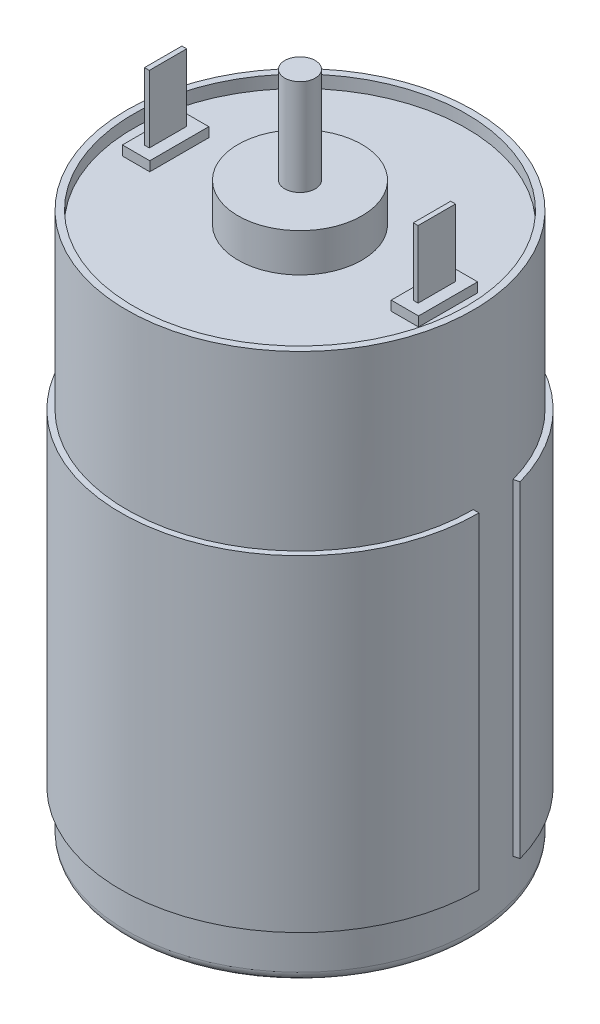
ISO-10303-21;
HEADER;
FILE_DESCRIPTION(('STEP AP214'),'2;1');
FILE_NAME('part.step','',(''),(''),'','','');
FILE_SCHEMA(('AUTOMOTIVE_DESIGN { 1 0 10303 214 1 1 1 1 }'));
ENDSEC;
DATA;
#1=APPLICATION_CONTEXT('core data for automotive mechanical design processes');
#2=APPLICATION_PROTOCOL_DEFINITION('international standard','automotive_design',2000,#1);
#3=PRODUCT_CONTEXT('',#1,'mechanical');
#4=PRODUCT('Part','Part','',(#3));
#5=PRODUCT_RELATED_PRODUCT_CATEGORY('part','',(#4));
#6=PRODUCT_DEFINITION_FORMATION('','',#4);
#7=PRODUCT_DEFINITION_CONTEXT('part definition',#1,'design');
#8=PRODUCT_DEFINITION('design','',#6,#7);
#9=PRODUCT_DEFINITION_SHAPE('','',#8);
#10=(LENGTH_UNIT() NAMED_UNIT(*) SI_UNIT(.MILLI.,.METRE.));
#11=(NAMED_UNIT(*) PLANE_ANGLE_UNIT() SI_UNIT($,.RADIAN.));
#12=(NAMED_UNIT(*) SI_UNIT($,.STERADIAN.) SOLID_ANGLE_UNIT());
#13=UNCERTAINTY_MEASURE_WITH_UNIT(LENGTH_MEASURE(1.E-05),#10,'distance_accuracy_value','');
#14=(GEOMETRIC_REPRESENTATION_CONTEXT(3) GLOBAL_UNCERTAINTY_ASSIGNED_CONTEXT((#13)) GLOBAL_UNIT_ASSIGNED_CONTEXT((#10,
#11,#12)) REPRESENTATION_CONTEXT('',''));
#15=CARTESIAN_POINT('',(0.,0.,0.));
#16=DIRECTION('',(0.,0.,1.));
#17=DIRECTION('',(1.,0.,0.));
#18=AXIS2_PLACEMENT_3D('',#15,#16,#17);
#19=CARTESIAN_POINT('',(8.36013794230283,-41.1177858823778,28.2491855107877));
#20=DIRECTION('',(0.,-1.,0.));
#21=DIRECTION('',(0.,0.,-1.));
#22=AXIS2_PLACEMENT_3D('',#19,#20,#21);
#23=TOROIDAL_SURFACE('',#22,17.05,1.);
#24=CARTESIAN_POINT('',(8.36013794230283,-42.1177858823778,28.2491855107877));
#25=DIRECTION('',(0.,-1.,0.));
#26=DIRECTION('',(0.,0.,-1.));
#27=AXIS2_PLACEMENT_3D('',#24,#25,#26);
#28=CIRCLE('',#27,17.05);
#29=CARTESIAN_POINT('',(8.36013794230283,-42.1177858823778,11.1991855107877));
#30=VERTEX_POINT('',#29);
#31=EDGE_CURVE('E111',#30,#30,#28,.T.);
#32=ORIENTED_EDGE('',*,*,#31,.F.);
#33=EDGE_LOOP('',(#32));
#34=FACE_BOUND('',#33,.T.);
#35=CARTESIAN_POINT('',(8.36013794230283,-41.1177858823778,28.2491855107877));
#36=DIRECTION('',(0.,1.,0.));
#37=DIRECTION('',(0.,0.,-1.));
#38=AXIS2_PLACEMENT_3D('',#35,#36,#37);
#39=CIRCLE('',#38,18.05);
#40=CARTESIAN_POINT('',(8.36013794230283,-41.1177858823778,10.1991855107877));
#41=VERTEX_POINT('',#40);
#42=EDGE_CURVE('E86',#41,#41,#39,.T.);
#43=ORIENTED_EDGE('',*,*,#42,.F.);
#44=EDGE_LOOP('',(#43));
#45=FACE_BOUND('',#44,.T.);
#46=ADVANCED_FACE('F18',(#34,#45),#23,.T.);
#47=CARTESIAN_POINT('',(8.36013794230283,-45.6177858823778,28.2491855107877));
#48=DIRECTION('',(0.,-1.,0.));
#49=DIRECTION('',(0.,0.,-1.));
#50=AXIS2_PLACEMENT_3D('',#47,#48,#49);
#51=TOROIDAL_SURFACE('',#50,5.5,1.);
#52=CARTESIAN_POINT('',(8.36013794230283,-46.6177858823778,28.2491855107877));
#53=DIRECTION('',(0.,-1.,0.));
#54=DIRECTION('',(0.,0.,-1.));
#55=AXIS2_PLACEMENT_3D('',#52,#53,#54);
#56=CIRCLE('',#55,5.5);
#57=CARTESIAN_POINT('',(8.36013794230283,-46.6177858823778,22.7491855107877));
#58=VERTEX_POINT('',#57);
#59=EDGE_CURVE('E90',#58,#58,#56,.T.);
#60=ORIENTED_EDGE('',*,*,#59,.F.);
#61=EDGE_LOOP('',(#60));
#62=FACE_BOUND('',#61,.T.);
#63=CARTESIAN_POINT('',(8.36013794230283,-45.6177858823778,28.2491855107877));
#64=DIRECTION('',(0.,1.,0.));
#65=DIRECTION('',(0.,0.,-1.));
#66=AXIS2_PLACEMENT_3D('',#63,#64,#65);
#67=CIRCLE('',#66,6.5);
#68=CARTESIAN_POINT('',(8.36013794230283,-45.6177858823778,21.7491855107877));
#69=VERTEX_POINT('',#68);
#70=EDGE_CURVE('E77',#69,#69,#67,.T.);
#71=ORIENTED_EDGE('',*,*,#70,.F.);
#72=EDGE_LOOP('',(#71));
#73=FACE_BOUND('',#72,.T.);
#74=ADVANCED_FACE('F20',(#62,#73),#51,.T.);
#75=CARTESIAN_POINT('',(8.36013794230283,-42.1177858823778,15.7491855107877));
#76=DIRECTION('',(0.,-1.,0.));
#77=DIRECTION('',(-1.,0.,0.));
#78=AXIS2_PLACEMENT_3D('',#75,#76,#77);
#79=CONICAL_SURFACE('',#78,1.525,0.785398163397442);
#80=CARTESIAN_POINT('',(8.36013794230283,-41.8427858823777,15.7491855107877));
#81=DIRECTION('',(0.,-1.,0.));
#82=DIRECTION('',(-1.,0.,0.));
#83=AXIS2_PLACEMENT_3D('',#80,#81,#82);
#84=CIRCLE('',#83,1.25);
#85=CARTESIAN_POINT('',(7.11013794230283,-41.8427858823777,15.7491855107877));
#86=VERTEX_POINT('',#85);
#87=EDGE_CURVE('E11',#86,#86,#84,.T.);
#88=ORIENTED_EDGE('',*,*,#87,.F.);
#89=EDGE_LOOP('',(#88));
#90=FACE_BOUND('',#89,.T.);
#91=CARTESIAN_POINT('',(8.36013794230283,-42.1177858823778,15.7491855107877));
#92=DIRECTION('',(0.,-1.,0.));
#93=DIRECTION('',(-1.,0.,0.));
#94=AXIS2_PLACEMENT_3D('',#91,#92,#93);
#95=CIRCLE('',#94,1.525);
#96=CARTESIAN_POINT('',(6.83513794230283,-42.1177858823778,15.7491855107877));
#97=VERTEX_POINT('',#96);
#98=EDGE_CURVE('E134',#97,#97,#95,.T.);
#99=ORIENTED_EDGE('',*,*,#98,.T.);
#100=EDGE_LOOP('',(#99));
#101=FACE_BOUND('',#100,.T.);
#102=ADVANCED_FACE('F547',(#90,#101),#79,.F.);
#103=CARTESIAN_POINT('',(8.36013794230283,-42.1177858823778,15.7491855107877));
#104=DIRECTION('',(0.,-1.,0.));
#105=DIRECTION('',(-1.,0.,0.));
#106=AXIS2_PLACEMENT_3D('',#103,#104,#105);
#107=CYLINDRICAL_SURFACE('',#106,1.25);
#108=CARTESIAN_POINT('',(8.36013794230283,-38.6177858823777,15.7491855107877));
#109=DIRECTION('',(0.,-1.,0.));
#110=DIRECTION('',(-1.,0.,0.));
#111=AXIS2_PLACEMENT_3D('',#108,#109,#110);
#112=CIRCLE('',#111,1.25);
#113=CARTESIAN_POINT('',(7.11013794230283,-38.6177858823777,15.7491855107877));
#114=VERTEX_POINT('',#113);
#115=EDGE_CURVE('E27',#114,#114,#112,.T.);
#116=ORIENTED_EDGE('',*,*,#115,.F.);
#117=EDGE_LOOP('',(#116));
#118=FACE_BOUND('',#117,.T.);
#119=ORIENTED_EDGE('',*,*,#87,.T.);
#120=EDGE_LOOP('',(#119));
#121=FACE_BOUND('',#120,.T.);
#122=ADVANCED_FACE('F551',(#118,#121),#107,.F.);
#123=CARTESIAN_POINT('',(8.36013794230283,-38.6177858823777,15.7491855107877));
#124=DIRECTION('',(0.,-1.,0.));
#125=DIRECTION('',(-1.,0.,0.));
#126=AXIS2_PLACEMENT_3D('',#123,#124,#125);
#127=CONICAL_SURFACE('',#126,1.25,1.02974425867665);
#128=CARTESIAN_POINT('',(8.36013794230283,-37.8667101085933,15.7491855107877));
#129=VERTEX_POINT('',#128);
#130=VERTEX_LOOP('',#129);
#131=FACE_BOUND('',#130,.T.);
#132=ORIENTED_EDGE('',*,*,#115,.T.);
#133=EDGE_LOOP('',(#132));
#134=FACE_BOUND('',#133,.T.);
#135=ADVANCED_FACE('F700',(#131,#134),#127,.F.);
#136=CARTESIAN_POINT('',(8.36013794230283,-42.1177858823778,40.7491855107877));
#137=DIRECTION('',(0.,-1.,0.));
#138=DIRECTION('',(-1.,0.,0.));
#139=AXIS2_PLACEMENT_3D('',#136,#137,#138);
#140=CONICAL_SURFACE('',#139,1.525,0.785398163397442);
#141=CARTESIAN_POINT('',(8.36013794230283,-41.8427858823777,40.7491855107877));
#142=DIRECTION('',(0.,-1.,0.));
#143=DIRECTION('',(-1.,0.,0.));
#144=AXIS2_PLACEMENT_3D('',#141,#142,#143);
#145=CIRCLE('',#144,1.25);
#146=CARTESIAN_POINT('',(7.11013794230283,-41.8427858823777,40.7491855107877));
#147=VERTEX_POINT('',#146);
#148=EDGE_CURVE('E76',#147,#147,#145,.T.);
#149=ORIENTED_EDGE('',*,*,#148,.F.);
#150=EDGE_LOOP('',(#149));
#151=FACE_BOUND('',#150,.T.);
#152=CARTESIAN_POINT('',(8.36013794230283,-42.1177858823778,40.7491855107877));
#153=DIRECTION('',(0.,-1.,0.));
#154=DIRECTION('',(-1.,0.,0.));
#155=AXIS2_PLACEMENT_3D('',#152,#153,#154);
#156=CIRCLE('',#155,1.525);
#157=CARTESIAN_POINT('',(6.83513794230283,-42.1177858823778,40.7491855107877));
#158=VERTEX_POINT('',#157);
#159=EDGE_CURVE('E130',#158,#158,#156,.T.);
#160=ORIENTED_EDGE('',*,*,#159,.T.);
#161=EDGE_LOOP('',(#160));
#162=FACE_BOUND('',#161,.T.);
#163=ADVANCED_FACE('F696',(#151,#162),#140,.F.);
#164=CARTESIAN_POINT('',(8.36013794230283,-42.1177858823778,40.7491855107877));
#165=DIRECTION('',(0.,-1.,0.));
#166=DIRECTION('',(-1.,0.,0.));
#167=AXIS2_PLACEMENT_3D('',#164,#165,#166);
#168=CYLINDRICAL_SURFACE('',#167,1.25);
#169=CARTESIAN_POINT('',(8.36013794230283,-38.6177858823777,40.7491855107877));
#170=DIRECTION('',(0.,-1.,0.));
#171=DIRECTION('',(-1.,0.,0.));
#172=AXIS2_PLACEMENT_3D('',#169,#170,#171);
#173=CIRCLE('',#172,1.25);
#174=CARTESIAN_POINT('',(7.11013794230283,-38.6177858823777,40.7491855107877));
#175=VERTEX_POINT('',#174);
#176=EDGE_CURVE('E72',#175,#175,#173,.T.);
#177=ORIENTED_EDGE('',*,*,#176,.F.);
#178=EDGE_LOOP('',(#177));
#179=FACE_BOUND('',#178,.T.);
#180=ORIENTED_EDGE('',*,*,#148,.T.);
#181=EDGE_LOOP('',(#180));
#182=FACE_BOUND('',#181,.T.);
#183=ADVANCED_FACE('F68',(#179,#182),#168,.F.);
#184=CARTESIAN_POINT('',(8.36013794230283,-38.6177858823777,40.7491855107877));
#185=DIRECTION('',(0.,-1.,0.));
#186=DIRECTION('',(-1.,0.,0.));
#187=AXIS2_PLACEMENT_3D('',#184,#185,#186);
#188=CONICAL_SURFACE('',#187,1.25,1.02974425867665);
#189=CARTESIAN_POINT('',(8.36013794230283,-37.8667101085933,40.7491855107877));
#190=VERTEX_POINT('',#189);
#191=VERTEX_LOOP('',#190);
#192=FACE_BOUND('',#191,.T.);
#193=ORIENTED_EDGE('',*,*,#176,.T.);
#194=EDGE_LOOP('',(#193));
#195=FACE_BOUND('',#194,.T.);
#196=ADVANCED_FACE('F64',(#192,#195),#188,.F.);
#197=CARTESIAN_POINT('',(8.36013794230283,-51.1177858823778,28.2491855107877));
#198=DIRECTION('',(0.,1.,0.));
#199=DIRECTION('',(1.,0.,0.));
#200=AXIS2_PLACEMENT_3D('',#197,#198,#199);
#201=CYLINDRICAL_SURFACE('',#200,1.5875);
#202=CARTESIAN_POINT('',(8.36013794230283,-51.1177858823778,28.2491855107877));
#203=DIRECTION('',(0.,-1.,0.));
#204=DIRECTION('',(-1.,0.,0.));
#205=AXIS2_PLACEMENT_3D('',#202,#203,#204);
#206=CIRCLE('',#205,1.5875);
#207=CARTESIAN_POINT('',(6.77263794230283,-51.1177858823778,28.2491855107877));
#208=VERTEX_POINT('',#207);
#209=EDGE_CURVE('E1054',#208,#208,#206,.T.);
#210=ORIENTED_EDGE('',*,*,#209,.F.);
#211=EDGE_LOOP('',(#210));
#212=FACE_BOUND('',#211,.T.);
#213=CARTESIAN_POINT('',(8.36013794230283,-46.6177858823778,28.2491855107877));
#214=DIRECTION('',(0.,-1.,0.));
#215=DIRECTION('',(-1.,0.,0.));
#216=AXIS2_PLACEMENT_3D('',#213,#214,#215);
#217=CIRCLE('',#216,1.5875);
#218=CARTESIAN_POINT('',(6.77263794230283,-46.6177858823778,28.2491855107877));
#219=VERTEX_POINT('',#218);
#220=EDGE_CURVE('E107',#219,#219,#217,.T.);
#221=ORIENTED_EDGE('',*,*,#220,.T.);
#222=EDGE_LOOP('',(#221));
#223=FACE_BOUND('',#222,.T.);
#224=ADVANCED_FACE('F67',(#212,#223),#201,.T.);
#225=CARTESIAN_POINT('',(8.36013794230283,-46.6177858823778,28.2491855107877));
#226=DIRECTION('',(0.,1.,0.));
#227=DIRECTION('',(1.,0.,0.));
#228=AXIS2_PLACEMENT_3D('',#225,#226,#227);
#229=CYLINDRICAL_SURFACE('',#228,6.5);
#230=CARTESIAN_POINT('',(8.36013794230283,-42.1177858823778,28.2491855107877));
#231=DIRECTION('',(0.,-1.,0.));
#232=DIRECTION('',(-1.,0.,0.));
#233=AXIS2_PLACEMENT_3D('',#230,#231,#232);
#234=CIRCLE('',#233,6.5);
#235=CARTESIAN_POINT('',(1.86013794230283,-42.1177858823778,28.2491855107877));
#236=VERTEX_POINT('',#235);
#237=EDGE_CURVE('E121',#236,#236,#234,.T.);
#238=ORIENTED_EDGE('',*,*,#237,.T.);
#239=EDGE_LOOP('',(#238));
#240=FACE_BOUND('',#239,.T.);
#241=ORIENTED_EDGE('',*,*,#70,.T.);
#242=EDGE_LOOP('',(#241));
#243=FACE_BOUND('',#242,.T.);
#244=ADVANCED_FACE('F735',(#240,#243),#229,.T.);
#245=CARTESIAN_POINT('',(8.36013794230283,-3.11778588237776,28.2491855107877));
#246=DIRECTION('',(0.,-1.,0.));
#247=DIRECTION('',(-1.,0.,0.));
#248=AXIS2_PLACEMENT_3D('',#245,#246,#247);
#249=CYLINDRICAL_SURFACE('',#248,18.65);
#250=CARTESIAN_POINT('',(8.36013794230283,-3.11778588237776,28.2491855107877));
#251=DIRECTION('',(0.,1.,0.));
#252=DIRECTION('',(1.,0.,0.));
#253=AXIS2_PLACEMENT_3D('',#250,#251,#252);
#254=CIRCLE('',#253,18.65);
#255=CARTESIAN_POINT('',(26.3398966554396,-3.11778588237776,23.2943114843987));
#256=VERTEX_POINT('',#255);
#257=CARTESIAN_POINT('',(27.0101379423029,-3.11778588237776,28.2491855107877));
#258=VERTEX_POINT('',#257);
#259=EDGE_CURVE('E139',#256,#258,#254,.T.);
#260=ORIENTED_EDGE('',*,*,#259,.F.);
#261=DIRECTION('',(0.,-1.,0.));
#262=VECTOR('',#261,1.);
#263=CARTESIAN_POINT('',(26.3398966554396,-3.11778588237776,23.2943114843987));
#264=LINE('',#263,#262);
#265=CARTESIAN_POINT('',(26.3398966554396,-37.1177858823777,23.2943114843987));
#266=VERTEX_POINT('',#265);
#267=EDGE_CURVE('E192',#256,#266,#264,.T.);
#268=ORIENTED_EDGE('',*,*,#267,.T.);
#269=CARTESIAN_POINT('',(8.36013794230283,-37.1177858823777,28.2491855107877));
#270=DIRECTION('',(0.,1.,0.));
#271=DIRECTION('',(1.,0.,0.));
#272=AXIS2_PLACEMENT_3D('',#269,#270,#271);
#273=CIRCLE('',#272,18.65);
#274=CARTESIAN_POINT('',(27.0101379423029,-37.1177858823777,28.2491855107877));
#275=VERTEX_POINT('',#274);
#276=EDGE_CURVE('E106',#266,#275,#273,.T.);
#277=ORIENTED_EDGE('',*,*,#276,.T.);
#278=DIRECTION('',(0.,-1.,0.));
#279=VECTOR('',#278,1.);
#280=CARTESIAN_POINT('',(27.0101379423029,-3.11778588237776,28.2491855107877));
#281=LINE('',#280,#279);
#282=EDGE_CURVE('E196',#258,#275,#281,.T.);
#283=ORIENTED_EDGE('',*,*,#282,.F.);
#284=EDGE_LOOP('',(#260,#268,#277,#283));
#285=FACE_BOUND('',#284,.T.);
#286=ADVANCED_FACE('F726',(#285),#249,.T.);
#287=CARTESIAN_POINT('',(8.36013794230283,-51.1177858823778,28.2491855107877));
#288=DIRECTION('',(0.,1.,0.));
#289=DIRECTION('',(1.,0.,0.));
#290=AXIS2_PLACEMENT_3D('',#287,#288,#289);
#291=CYLINDRICAL_SURFACE('',#290,1.5875);
#292=CARTESIAN_POINT('',(8.36013794230283,27.5822141176222,28.2491855107877));
#293=DIRECTION('',(0.,1.,0.));
#294=DIRECTION('',(1.,0.,0.));
#295=AXIS2_PLACEMENT_3D('',#292,#293,#294);
#296=CIRCLE('',#295,1.5875);
#297=CARTESIAN_POINT('',(9.94763794230283,27.5822141176222,28.2491855107877));
#298=VERTEX_POINT('',#297);
#299=EDGE_CURVE('E159',#298,#298,#296,.T.);
#300=ORIENTED_EDGE('',*,*,#299,.F.);
#301=EDGE_LOOP('',(#300));
#302=FACE_BOUND('',#301,.T.);
#303=CARTESIAN_POINT('',(8.36013794230283,17.5822141176223,28.2491855107877));
#304=DIRECTION('',(0.,1.,0.));
#305=DIRECTION('',(1.,0.,0.));
#306=AXIS2_PLACEMENT_3D('',#303,#304,#305);
#307=CIRCLE('',#306,1.5875);
#308=CARTESIAN_POINT('',(9.94763794230283,17.5822141176223,28.2491855107877));
#309=VERTEX_POINT('',#308);
#310=EDGE_CURVE('E158',#309,#309,#307,.T.);
#311=ORIENTED_EDGE('',*,*,#310,.T.);
#312=EDGE_LOOP('',(#311));
#313=FACE_BOUND('',#312,.T.);
#314=ADVANCED_FACE('F717',(#302,#313),#291,.T.);
#315=CARTESIAN_POINT('',(8.36013794230283,17.5822141176223,28.2491855107877));
#316=DIRECTION('',(0.,-1.,0.));
#317=DIRECTION('',(-1.,0.,0.));
#318=AXIS2_PLACEMENT_3D('',#315,#316,#317);
#319=CYLINDRICAL_SURFACE('',#318,6.45);
#320=CARTESIAN_POINT('',(8.36013794230283,17.5822141176223,28.2491855107877));
#321=DIRECTION('',(0.,1.,0.));
#322=DIRECTION('',(1.,0.,0.));
#323=AXIS2_PLACEMENT_3D('',#320,#321,#322);
#324=CIRCLE('',#323,6.45);
#325=CARTESIAN_POINT('',(14.8101379423028,17.5822141176223,28.2491855107877));
#326=VERTEX_POINT('',#325);
#327=EDGE_CURVE('E154',#326,#326,#324,.T.);
#328=ORIENTED_EDGE('',*,*,#327,.F.);
#329=EDGE_LOOP('',(#328));
#330=FACE_BOUND('',#329,.T.);
#331=CARTESIAN_POINT('',(8.36013794230283,13.5822141176222,28.2491855107877));
#332=DIRECTION('',(0.,1.,0.));
#333=DIRECTION('',(1.,0.,0.));
#334=AXIS2_PLACEMENT_3D('',#331,#332,#333);
#335=CIRCLE('',#334,6.45);
#336=CARTESIAN_POINT('',(14.8101379423028,13.5822141176222,28.2491855107877));
#337=VERTEX_POINT('',#336);
#338=EDGE_CURVE('E372',#337,#337,#335,.T.);
#339=ORIENTED_EDGE('',*,*,#338,.T.);
#340=EDGE_LOOP('',(#339));
#341=FACE_BOUND('',#340,.T.);
#342=ADVANCED_FACE('F666',(#330,#341),#319,.T.);
#343=CARTESIAN_POINT('',(8.36013794230283,13.5822141176222,28.2491855107877));
#344=DIRECTION('',(0.,1.,0.));
#345=DIRECTION('',(1.,0.,0.));
#346=AXIS2_PLACEMENT_3D('',#343,#344,#345);
#347=CYLINDRICAL_SURFACE('',#346,17.35);
#348=CARTESIAN_POINT('',(8.36013794230283,13.5822141176222,28.2491855107877));
#349=DIRECTION('',(0.,1.,0.));
#350=DIRECTION('',(1.,0.,0.));
#351=AXIS2_PLACEMENT_3D('',#348,#349,#350);
#352=CIRCLE('',#351,17.35);
#353=CARTESIAN_POINT('',(25.7101379423028,13.5822141176222,28.2491855107877));
#354=VERTEX_POINT('',#353);
#355=EDGE_CURVE('E238',#354,#354,#352,.T.);
#356=ORIENTED_EDGE('',*,*,#355,.F.);
#357=EDGE_LOOP('',(#356));
#358=FACE_BOUND('',#357,.T.);
#359=CARTESIAN_POINT('',(8.36013794230283,14.8822141176222,28.2491855107877));
#360=DIRECTION('',(0.,1.,0.));
#361=DIRECTION('',(1.,0.,0.));
#362=AXIS2_PLACEMENT_3D('',#359,#360,#361);
#363=CIRCLE('',#362,17.35);
#364=CARTESIAN_POINT('',(25.7101379423028,14.8822141176222,28.2491855107877));
#365=VERTEX_POINT('',#364);
#366=EDGE_CURVE('E208',#365,#365,#363,.T.);
#367=ORIENTED_EDGE('',*,*,#366,.T.);
#368=EDGE_LOOP('',(#367));
#369=FACE_BOUND('',#368,.T.);
#370=ADVANCED_FACE('F661',(#358,#369),#347,.F.);
#371=CARTESIAN_POINT('',(8.36013794230283,-42.1177858823778,28.2491855107877));
#372=DIRECTION('',(0.,1.,0.));
#373=DIRECTION('',(1.,0.,0.));
#374=AXIS2_PLACEMENT_3D('',#371,#372,#373);
#375=CYLINDRICAL_SURFACE('',#374,18.05);
#376=DIRECTION('',(0.,-1.,0.));
#377=VECTOR('',#376,1.);
#378=CARTESIAN_POINT('',(26.4101379423028,-3.11778588237776,28.2491855107877));
#379=LINE('',#378,#377);
#380=CARTESIAN_POINT('',(26.4101379423028,-3.11778588237776,28.2491855107877));
#381=VERTEX_POINT('',#380);
#382=CARTESIAN_POINT('',(26.4101379423028,-37.1177858823777,28.2491855107877));
#383=VERTEX_POINT('',#382);
#384=EDGE_CURVE('E143',#381,#383,#379,.T.);
#385=ORIENTED_EDGE('',*,*,#384,.T.);
#386=CARTESIAN_POINT('',(8.36013794230283,-37.1177858823777,28.2491855107877));
#387=DIRECTION('',(0.,-1.,0.));
#388=DIRECTION('',(1.,0.,0.));
#389=AXIS2_PLACEMENT_3D('',#386,#387,#388);
#390=CIRCLE('',#389,18.05);
#391=CARTESIAN_POINT('',(25.7614593778052,-37.1177858823777,23.453717619296));
#392=VERTEX_POINT('',#391);
#393=EDGE_CURVE('E126',#383,#392,#390,.T.);
#394=ORIENTED_EDGE('',*,*,#393,.T.);
#395=DIRECTION('',(0.,-1.,0.));
#396=VECTOR('',#395,1.);
#397=CARTESIAN_POINT('',(25.7614593778052,-3.11778588237776,23.453717619296));
#398=LINE('',#397,#396);
#399=CARTESIAN_POINT('',(25.7614593778052,-3.11778588237776,23.453717619296));
#400=VERTEX_POINT('',#399);
#401=EDGE_CURVE('E187',#400,#392,#398,.T.);
#402=ORIENTED_EDGE('',*,*,#401,.F.);
#403=CARTESIAN_POINT('',(8.36013794230283,-3.11778588237776,28.2491855107877));
#404=DIRECTION('',(0.,-1.,0.));
#405=DIRECTION('',(1.,0.,0.));
#406=AXIS2_PLACEMENT_3D('',#403,#404,#405);
#407=CIRCLE('',#406,18.05);
#408=EDGE_CURVE('E101',#381,#400,#407,.T.);
#409=ORIENTED_EDGE('',*,*,#408,.F.);
#410=EDGE_LOOP('',(#385,#394,#402,#409));
#411=FACE_BOUND('',#410,.T.);
#412=CARTESIAN_POINT('',(8.36013794230283,14.8822141176222,28.2491855107877));
#413=DIRECTION('',(0.,-1.,0.));
#414=DIRECTION('',(-1.,0.,0.));
#415=AXIS2_PLACEMENT_3D('',#412,#413,#414);
#416=CIRCLE('',#415,18.05);
#417=CARTESIAN_POINT('',(-9.68986205769717,14.8822141176222,28.2491855107877));
#418=VERTEX_POINT('',#417);
#419=EDGE_CURVE('E204',#418,#418,#416,.T.);
#420=ORIENTED_EDGE('',*,*,#419,.T.);
#421=EDGE_LOOP('',(#420));
#422=FACE_BOUND('',#421,.T.);
#423=ORIENTED_EDGE('',*,*,#42,.T.);
#424=EDGE_LOOP('',(#423));
#425=FACE_BOUND('',#424,.T.);
#426=ADVANCED_FACE('F665',(#411,#422,#425),#375,.T.);
#427=CARTESIAN_POINT('',(8.36013794230283,14.5822141176222,28.2491855107877));
#428=DIRECTION('',(0.,-1.,0.));
#429=DIRECTION('',(0.,0.,-1.));
#430=AXIS2_PLACEMENT_3D('',#427,#428,#429);
#431=PLANE('',#430);
#432=DIRECTION('',(0.,0.,-1.));
#433=VECTOR('',#432,1.);
#434=CARTESIAN_POINT('',(23.7851379423028,14.5822141176222,31.3241855107877));
#435=LINE('',#434,#433);
#436=CARTESIAN_POINT('',(23.7851379423028,14.5822141176222,31.3241855107877));
#437=VERTEX_POINT('',#436);
#438=CARTESIAN_POINT('',(23.7851379423028,14.5822141176222,25.1741855107877));
#439=VERTEX_POINT('',#438);
#440=EDGE_CURVE('E178',#437,#439,#435,.T.);
#441=ORIENTED_EDGE('',*,*,#440,.T.);
#442=DIRECTION('',(-1.,0.,0.));
#443=VECTOR('',#442,1.);
#444=CARTESIAN_POINT('',(8.36013794230283,14.5822141176222,25.1741855107877));
#445=LINE('',#444,#443);
#446=CARTESIAN_POINT('',(20.9351379423028,14.5822141176222,25.1741855107877));
#447=VERTEX_POINT('',#446);
#448=EDGE_CURVE('E116',#439,#447,#445,.T.);
#449=ORIENTED_EDGE('',*,*,#448,.T.);
#450=DIRECTION('',(0.,0.,1.));
#451=VECTOR('',#450,1.);
#452=CARTESIAN_POINT('',(20.9351379423028,14.5822141176222,31.3241855107877));
#453=LINE('',#452,#451);
#454=CARTESIAN_POINT('',(20.9351379423028,14.5822141176222,31.3241855107877));
#455=VERTEX_POINT('',#454);
#456=EDGE_CURVE('E138',#447,#455,#453,.T.);
#457=ORIENTED_EDGE('',*,*,#456,.T.);
#458=DIRECTION('',(1.,0.,0.));
#459=VECTOR('',#458,1.);
#460=CARTESIAN_POINT('',(8.36013794230283,14.5822141176222,31.3241855107877));
#461=LINE('',#460,#459);
#462=EDGE_CURVE('E166',#455,#437,#461,.T.);
#463=ORIENTED_EDGE('',*,*,#462,.T.);
#464=EDGE_LOOP('',(#441,#449,#457,#463));
#465=FACE_BOUND('',#464,.T.);
#466=DIRECTION('',(0.,0.,-1.));
#467=VECTOR('',#466,1.);
#468=CARTESIAN_POINT('',(22.6101379423028,14.5822141176222,30.1991855107877));
#469=LINE('',#468,#467);
#470=CARTESIAN_POINT('',(22.6101379423028,14.5822141176222,30.1991855107877));
#471=VERTEX_POINT('',#470);
#472=CARTESIAN_POINT('',(22.6101379423028,14.5822141176222,26.2991855107877));
#473=VERTEX_POINT('',#472);
#474=EDGE_CURVE('E285',#471,#473,#469,.T.);
#475=ORIENTED_EDGE('',*,*,#474,.F.);
#476=DIRECTION('',(1.,0.,0.));
#477=VECTOR('',#476,1.);
#478=CARTESIAN_POINT('',(-5.88986205769717,14.5822141176222,30.1991855107877));
#479=LINE('',#478,#477);
#480=CARTESIAN_POINT('',(22.1101379423028,14.5822141176222,30.1991855107877));
#481=VERTEX_POINT('',#480);
#482=EDGE_CURVE('E145',#481,#471,#479,.T.);
#483=ORIENTED_EDGE('',*,*,#482,.F.);
#484=DIRECTION('',(0.,0.,1.));
#485=VECTOR('',#484,1.);
#486=CARTESIAN_POINT('',(22.1101379423028,14.5822141176222,30.1991855107877));
#487=LINE('',#486,#485);
#488=CARTESIAN_POINT('',(22.1101379423028,14.5822141176222,26.2991855107877));
#489=VERTEX_POINT('',#488);
#490=EDGE_CURVE('E253',#489,#481,#487,.T.);
#491=ORIENTED_EDGE('',*,*,#490,.F.);
#492=DIRECTION('',(-1.,0.,0.));
#493=VECTOR('',#492,1.);
#494=CARTESIAN_POINT('',(-5.88986205769717,14.5822141176222,26.2991855107877));
#495=LINE('',#494,#493);
#496=EDGE_CURVE('E261',#473,#489,#495,.T.);
#497=ORIENTED_EDGE('',*,*,#496,.F.);
#498=EDGE_LOOP('',(#475,#483,#491,#497));
#499=FACE_BOUND('',#498,.T.);
#500=ADVANCED_FACE('F464',(#465,#499),#431,.F.);
#501=CARTESIAN_POINT('',(8.36013794230283,14.5822141176222,28.2491855107877));
#502=DIRECTION('',(0.,-1.,0.));
#503=DIRECTION('',(0.,0.,-1.));
#504=AXIS2_PLACEMENT_3D('',#501,#502,#503);
#505=PLANE('',#504);
#506=DIRECTION('',(0.,0.,-1.));
#507=VECTOR('',#506,1.);
#508=CARTESIAN_POINT('',(-4.21486205769717,14.5822141176222,31.3241855107877));
#509=LINE('',#508,#507);
#510=CARTESIAN_POINT('',(-4.21486205769717,14.5822141176222,31.3241855107877));
#511=VERTEX_POINT('',#510);
#512=CARTESIAN_POINT('',(-4.21486205769717,14.5822141176222,25.1741855107877));
#513=VERTEX_POINT('',#512);
#514=EDGE_CURVE('E164',#511,#513,#509,.T.);
#515=ORIENTED_EDGE('',*,*,#514,.T.);
#516=DIRECTION('',(-1.,0.,0.));
#517=VECTOR('',#516,1.);
#518=CARTESIAN_POINT('',(-7.06486205769717,14.5822141176222,25.1741855107877));
#519=LINE('',#518,#517);
#520=CARTESIAN_POINT('',(-7.06486205769717,14.5822141176222,25.1741855107877));
#521=VERTEX_POINT('',#520);
#522=EDGE_CURVE('E245',#513,#521,#519,.T.);
#523=ORIENTED_EDGE('',*,*,#522,.T.);
#524=DIRECTION('',(0.,0.,1.));
#525=VECTOR('',#524,1.);
#526=CARTESIAN_POINT('',(-7.06486205769717,14.5822141176222,31.3241855107877));
#527=LINE('',#526,#525);
#528=CARTESIAN_POINT('',(-7.06486205769717,14.5822141176222,31.3241855107877));
#529=VERTEX_POINT('',#528);
#530=EDGE_CURVE('E274',#521,#529,#527,.T.);
#531=ORIENTED_EDGE('',*,*,#530,.T.);
#532=DIRECTION('',(1.,0.,0.));
#533=VECTOR('',#532,1.);
#534=CARTESIAN_POINT('',(-7.06486205769717,14.5822141176222,31.3241855107877));
#535=LINE('',#534,#533);
#536=EDGE_CURVE('E347',#529,#511,#535,.T.);
#537=ORIENTED_EDGE('',*,*,#536,.T.);
#538=EDGE_LOOP('',(#515,#523,#531,#537));
#539=FACE_BOUND('',#538,.T.);
#540=DIRECTION('',(0.,0.,-1.));
#541=VECTOR('',#540,1.);
#542=CARTESIAN_POINT('',(-5.38986205769717,14.5822141176222,30.1991855107877));
#543=LINE('',#542,#541);
#544=CARTESIAN_POINT('',(-5.38986205769717,14.5822141176222,30.1991855107877));
#545=VERTEX_POINT('',#544);
#546=CARTESIAN_POINT('',(-5.38986205769717,14.5822141176222,26.2991855107877));
#547=VERTEX_POINT('',#546);
#548=EDGE_CURVE('E320',#545,#547,#543,.T.);
#549=ORIENTED_EDGE('',*,*,#548,.F.);
#550=DIRECTION('',(1.,0.,0.));
#551=VECTOR('',#550,1.);
#552=CARTESIAN_POINT('',(-5.88986205769717,14.5822141176222,30.1991855107877));
#553=LINE('',#552,#551);
#554=CARTESIAN_POINT('',(-5.88986205769717,14.5822141176222,30.1991855107877));
#555=VERTEX_POINT('',#554);
#556=EDGE_CURVE('E216',#555,#545,#553,.T.);
#557=ORIENTED_EDGE('',*,*,#556,.F.);
#558=DIRECTION('',(0.,0.,1.));
#559=VECTOR('',#558,1.);
#560=CARTESIAN_POINT('',(-5.88986205769717,14.5822141176222,30.1991855107877));
#561=LINE('',#560,#559);
#562=CARTESIAN_POINT('',(-5.88986205769717,14.5822141176222,26.2991855107877));
#563=VERTEX_POINT('',#562);
#564=EDGE_CURVE('E276',#563,#555,#561,.T.);
#565=ORIENTED_EDGE('',*,*,#564,.F.);
#566=DIRECTION('',(-1.,0.,0.));
#567=VECTOR('',#566,1.);
#568=CARTESIAN_POINT('',(-5.88986205769717,14.5822141176222,26.2991855107877));
#569=LINE('',#568,#567);
#570=EDGE_CURVE('E312',#547,#563,#569,.T.);
#571=ORIENTED_EDGE('',*,*,#570,.F.);
#572=EDGE_LOOP('',(#549,#557,#565,#571));
#573=FACE_BOUND('',#572,.T.);
#574=ADVANCED_FACE('F459',(#539,#573),#505,.F.);
#575=CARTESIAN_POINT('',(8.36013794230283,13.5822141176222,28.2491855107877));
#576=DIRECTION('',(0.,1.,0.));
#577=DIRECTION('',(1.,0.,0.));
#578=AXIS2_PLACEMENT_3D('',#575,#576,#577);
#579=PLANE('',#578);
#580=ORIENTED_EDGE('',*,*,#338,.F.);
#581=EDGE_LOOP('',(#580));
#582=FACE_BOUND('',#581,.T.);
#583=ORIENTED_EDGE('',*,*,#355,.T.);
#584=EDGE_LOOP('',(#583));
#585=FACE_BOUND('',#584,.T.);
#586=DIRECTION('',(-1.,0.,0.));
#587=VECTOR('',#586,1.);
#588=CARTESIAN_POINT('',(-7.06486205769717,13.5822141176222,25.1741855107877));
#589=LINE('',#588,#587);
#590=CARTESIAN_POINT('',(-4.21486205769717,13.5822141176222,25.1741855107877));
#591=VERTEX_POINT('',#590);
#592=CARTESIAN_POINT('',(-7.06486205769717,13.5822141176222,25.1741855107877));
#593=VERTEX_POINT('',#592);
#594=EDGE_CURVE('E249',#591,#593,#589,.T.);
#595=ORIENTED_EDGE('',*,*,#594,.F.);
#596=DIRECTION('',(0.,0.,-1.));
#597=VECTOR('',#596,1.);
#598=CARTESIAN_POINT('',(-4.21486205769717,13.5822141176222,31.3241855107877));
#599=LINE('',#598,#597);
#600=CARTESIAN_POINT('',(-4.21486205769717,13.5822141176222,31.3241855107877));
#601=VERTEX_POINT('',#600);
#602=EDGE_CURVE('E160',#601,#591,#599,.T.);
#603=ORIENTED_EDGE('',*,*,#602,.F.);
#604=DIRECTION('',(1.,0.,0.));
#605=VECTOR('',#604,1.);
#606=CARTESIAN_POINT('',(-7.06486205769717,13.5822141176222,31.3241855107877));
#607=LINE('',#606,#605);
#608=CARTESIAN_POINT('',(-7.06486205769717,13.5822141176222,31.3241855107877));
#609=VERTEX_POINT('',#608);
#610=EDGE_CURVE('E182',#609,#601,#607,.T.);
#611=ORIENTED_EDGE('',*,*,#610,.F.);
#612=DIRECTION('',(0.,0.,1.));
#613=VECTOR('',#612,1.);
#614=CARTESIAN_POINT('',(-7.06486205769717,13.5822141176222,31.3241855107877));
#615=LINE('',#614,#613);
#616=EDGE_CURVE('E270',#593,#609,#615,.T.);
#617=ORIENTED_EDGE('',*,*,#616,.F.);
#618=EDGE_LOOP('',(#595,#603,#611,#617));
#619=FACE_BOUND('',#618,.T.);
#620=DIRECTION('',(-1.,0.,0.));
#621=VECTOR('',#620,1.);
#622=CARTESIAN_POINT('',(-7.06486205769717,13.5822141176222,25.1741855107877));
#623=LINE('',#622,#621);
#624=CARTESIAN_POINT('',(23.7851379423028,13.5822141176222,25.1741855107877));
#625=VERTEX_POINT('',#624);
#626=CARTESIAN_POINT('',(20.9351379423028,13.5822141176222,25.1741855107877));
#627=VERTEX_POINT('',#626);
#628=EDGE_CURVE('E112',#625,#627,#623,.T.);
#629=ORIENTED_EDGE('',*,*,#628,.F.);
#630=DIRECTION('',(0.,0.,-1.));
#631=VECTOR('',#630,1.);
#632=CARTESIAN_POINT('',(23.7851379423028,13.5822141176222,31.3241855107877));
#633=LINE('',#632,#631);
#634=CARTESIAN_POINT('',(23.7851379423028,13.5822141176222,31.3241855107877));
#635=VERTEX_POINT('',#634);
#636=EDGE_CURVE('E183',#635,#625,#633,.T.);
#637=ORIENTED_EDGE('',*,*,#636,.F.);
#638=DIRECTION('',(1.,0.,0.));
#639=VECTOR('',#638,1.);
#640=CARTESIAN_POINT('',(-7.06486205769717,13.5822141176222,31.3241855107877));
#641=LINE('',#640,#639);
#642=CARTESIAN_POINT('',(20.9351379423028,13.5822141176222,31.3241855107877));
#643=VERTEX_POINT('',#642);
#644=EDGE_CURVE('E324',#643,#635,#641,.T.);
#645=ORIENTED_EDGE('',*,*,#644,.F.);
#646=DIRECTION('',(0.,0.,1.));
#647=VECTOR('',#646,1.);
#648=CARTESIAN_POINT('',(20.9351379423028,13.5822141176222,31.3241855107877));
#649=LINE('',#648,#647);
#650=EDGE_CURVE('E212',#627,#643,#649,.T.);
#651=ORIENTED_EDGE('',*,*,#650,.F.);
#652=EDGE_LOOP('',(#629,#637,#645,#651));
#653=FACE_BOUND('',#652,.T.);
#654=ADVANCED_FACE('F463',(#582,#585,#619,#653),#579,.T.);
#655=CARTESIAN_POINT('',(8.36013794230283,14.8822141176222,28.2491855107877));
#656=DIRECTION('',(0.,-1.,0.));
#657=DIRECTION('',(0.,0.,-1.));
#658=AXIS2_PLACEMENT_3D('',#655,#656,#657);
#659=PLANE('',#658);
#660=ORIENTED_EDGE('',*,*,#366,.F.);
#661=EDGE_LOOP('',(#660));
#662=FACE_BOUND('',#661,.T.);
#663=ORIENTED_EDGE('',*,*,#419,.F.);
#664=EDGE_LOOP('',(#663));
#665=FACE_BOUND('',#664,.T.);
#666=ADVANCED_FACE('F423',(#662,#665),#659,.F.);
#667=CARTESIAN_POINT('',(8.36013794230283,17.5822141176223,28.2491855107877));
#668=DIRECTION('',(0.,1.,0.));
#669=DIRECTION('',(1.,0.,0.));
#670=AXIS2_PLACEMENT_3D('',#667,#668,#669);
#671=PLANE('',#670);
#672=ORIENTED_EDGE('',*,*,#310,.F.);
#673=EDGE_LOOP('',(#672));
#674=FACE_BOUND('',#673,.T.);
#675=ORIENTED_EDGE('',*,*,#327,.T.);
#676=EDGE_LOOP('',(#675));
#677=FACE_BOUND('',#676,.T.);
#678=ADVANCED_FACE('F418',(#674,#677),#671,.T.);
#679=CARTESIAN_POINT('',(8.36013794230283,27.5822141176222,28.2491855107877));
#680=DIRECTION('',(0.,1.,0.));
#681=DIRECTION('',(1.,0.,0.));
#682=AXIS2_PLACEMENT_3D('',#679,#680,#681);
#683=PLANE('',#682);
#684=ORIENTED_EDGE('',*,*,#299,.T.);
#685=EDGE_LOOP('',(#684));
#686=FACE_BOUND('',#685,.T.);
#687=ADVANCED_FACE('F422',(#686),#683,.T.);
#688=CARTESIAN_POINT('',(-4.21486205769717,14.5822141176222,31.3241855107877));
#689=DIRECTION('',(-1.,0.,0.));
#690=DIRECTION('',(0.,1.,0.));
#691=AXIS2_PLACEMENT_3D('',#688,#689,#690);
#692=PLANE('',#691);
#693=ORIENTED_EDGE('',*,*,#602,.T.);
#694=DIRECTION('',(0.,-1.,0.));
#695=VECTOR('',#694,1.);
#696=CARTESIAN_POINT('',(-4.21486205769717,14.5822141176222,25.1741855107877));
#697=LINE('',#696,#695);
#698=EDGE_CURVE('E165',#513,#591,#697,.T.);
#699=ORIENTED_EDGE('',*,*,#698,.F.);
#700=ORIENTED_EDGE('',*,*,#514,.F.);
#701=DIRECTION('',(0.,-1.,0.));
#702=VECTOR('',#701,1.);
#703=CARTESIAN_POINT('',(-4.21486205769717,14.5822141176222,31.3241855107877));
#704=LINE('',#703,#702);
#705=EDGE_CURVE('E340',#511,#601,#704,.T.);
#706=ORIENTED_EDGE('',*,*,#705,.T.);
#707=EDGE_LOOP('',(#693,#699,#700,#706));
#708=FACE_BOUND('',#707,.T.);
#709=ADVANCED_FACE('F639',(#708),#692,.F.);
#710=CARTESIAN_POINT('',(-7.06486205769717,14.5822141176222,25.1741855107877));
#711=DIRECTION('',(0.,0.,1.));
#712=DIRECTION('',(1.,0.,0.));
#713=AXIS2_PLACEMENT_3D('',#710,#711,#712);
#714=PLANE('',#713);
#715=ORIENTED_EDGE('',*,*,#594,.T.);
#716=DIRECTION('',(0.,-1.,0.));
#717=VECTOR('',#716,1.);
#718=CARTESIAN_POINT('',(-7.06486205769717,14.5822141176222,25.1741855107877));
#719=LINE('',#718,#717);
#720=EDGE_CURVE('E302',#521,#593,#719,.T.);
#721=ORIENTED_EDGE('',*,*,#720,.F.);
#722=ORIENTED_EDGE('',*,*,#522,.F.);
#723=ORIENTED_EDGE('',*,*,#698,.T.);
#724=EDGE_LOOP('',(#715,#721,#722,#723));
#725=FACE_BOUND('',#724,.T.);
#726=ADVANCED_FACE('F614',(#725),#714,.F.);
#727=CARTESIAN_POINT('',(-7.06486205769717,14.5822141176222,31.3241855107877));
#728=DIRECTION('',(1.,0.,0.));
#729=DIRECTION('',(0.,0.,-1.));
#730=AXIS2_PLACEMENT_3D('',#727,#728,#729);
#731=PLANE('',#730);
#732=ORIENTED_EDGE('',*,*,#616,.T.);
#733=DIRECTION('',(0.,-1.,0.));
#734=VECTOR('',#733,1.);
#735=CARTESIAN_POINT('',(-7.06486205769717,14.5822141176222,31.3241855107877));
#736=LINE('',#735,#734);
#737=EDGE_CURVE('E275',#529,#609,#736,.T.);
#738=ORIENTED_EDGE('',*,*,#737,.F.);
#739=ORIENTED_EDGE('',*,*,#530,.F.);
#740=ORIENTED_EDGE('',*,*,#720,.T.);
#741=EDGE_LOOP('',(#732,#738,#739,#740));
#742=FACE_BOUND('',#741,.T.);
#743=ADVANCED_FACE('F609',(#742),#731,.F.);
#744=CARTESIAN_POINT('',(-7.06486205769717,14.5822141176222,31.3241855107877));
#745=DIRECTION('',(0.,0.,-1.));
#746=DIRECTION('',(-1.,0.,0.));
#747=AXIS2_PLACEMENT_3D('',#744,#745,#746);
#748=PLANE('',#747);
#749=ORIENTED_EDGE('',*,*,#610,.T.);
#750=ORIENTED_EDGE('',*,*,#705,.F.);
#751=ORIENTED_EDGE('',*,*,#536,.F.);
#752=ORIENTED_EDGE('',*,*,#737,.T.);
#753=EDGE_LOOP('',(#749,#750,#751,#752));
#754=FACE_BOUND('',#753,.T.);
#755=ADVANCED_FACE('F613',(#754),#748,.F.);
#756=CARTESIAN_POINT('',(23.7851379423028,14.5822141176222,31.3241855107877));
#757=DIRECTION('',(-1.,0.,0.));
#758=DIRECTION('',(0.,1.,0.));
#759=AXIS2_PLACEMENT_3D('',#756,#757,#758);
#760=PLANE('',#759);
#761=ORIENTED_EDGE('',*,*,#636,.T.);
#762=DIRECTION('',(0.,-1.,0.));
#763=VECTOR('',#762,1.);
#764=CARTESIAN_POINT('',(23.7851379423028,14.5822141176222,25.1741855107877));
#765=LINE('',#764,#763);
#766=EDGE_CURVE('E227',#439,#625,#765,.T.);
#767=ORIENTED_EDGE('',*,*,#766,.F.);
#768=ORIENTED_EDGE('',*,*,#440,.F.);
#769=DIRECTION('',(0.,-1.,0.));
#770=VECTOR('',#769,1.);
#771=CARTESIAN_POINT('',(23.7851379423028,14.5822141176222,31.3241855107877));
#772=LINE('',#771,#770);
#773=EDGE_CURVE('E171',#437,#635,#772,.T.);
#774=ORIENTED_EDGE('',*,*,#773,.T.);
#775=EDGE_LOOP('',(#761,#767,#768,#774));
#776=FACE_BOUND('',#775,.T.);
#777=ADVANCED_FACE('F603',(#776),#760,.F.);
#778=CARTESIAN_POINT('',(-7.06486205769717,14.5822141176222,25.1741855107877));
#779=DIRECTION('',(0.,0.,1.));
#780=DIRECTION('',(1.,0.,0.));
#781=AXIS2_PLACEMENT_3D('',#778,#779,#780);
#782=PLANE('',#781);
#783=ORIENTED_EDGE('',*,*,#628,.T.);
#784=DIRECTION('',(0.,-1.,0.));
#785=VECTOR('',#784,1.);
#786=CARTESIAN_POINT('',(20.9351379423028,14.5822141176222,25.1741855107877));
#787=LINE('',#786,#785);
#788=EDGE_CURVE('E117',#447,#627,#787,.T.);
#789=ORIENTED_EDGE('',*,*,#788,.F.);
#790=ORIENTED_EDGE('',*,*,#448,.F.);
#791=ORIENTED_EDGE('',*,*,#766,.T.);
#792=EDGE_LOOP('',(#783,#789,#790,#791));
#793=FACE_BOUND('',#792,.T.);
#794=ADVANCED_FACE('F594',(#793),#782,.F.);
#795=CARTESIAN_POINT('',(20.9351379423028,14.5822141176222,31.3241855107877));
#796=DIRECTION('',(1.,0.,0.));
#797=DIRECTION('',(0.,0.,-1.));
#798=AXIS2_PLACEMENT_3D('',#795,#796,#797);
#799=PLANE('',#798);
#800=ORIENTED_EDGE('',*,*,#650,.T.);
#801=DIRECTION('',(0.,-1.,0.));
#802=VECTOR('',#801,1.);
#803=CARTESIAN_POINT('',(20.9351379423028,14.5822141176222,31.3241855107877));
#804=LINE('',#803,#802);
#805=EDGE_CURVE('E170',#455,#643,#804,.T.);
#806=ORIENTED_EDGE('',*,*,#805,.F.);
#807=ORIENTED_EDGE('',*,*,#456,.F.);
#808=ORIENTED_EDGE('',*,*,#788,.T.);
#809=EDGE_LOOP('',(#800,#806,#807,#808));
#810=FACE_BOUND('',#809,.T.);
#811=ADVANCED_FACE('F585',(#810),#799,.F.);
#812=CARTESIAN_POINT('',(-7.06486205769717,14.5822141176222,31.3241855107877));
#813=DIRECTION('',(0.,0.,-1.));
#814=DIRECTION('',(-1.,0.,0.));
#815=AXIS2_PLACEMENT_3D('',#812,#813,#814);
#816=PLANE('',#815);
#817=ORIENTED_EDGE('',*,*,#644,.T.);
#818=ORIENTED_EDGE('',*,*,#773,.F.);
#819=ORIENTED_EDGE('',*,*,#462,.F.);
#820=ORIENTED_EDGE('',*,*,#805,.T.);
#821=EDGE_LOOP('',(#817,#818,#819,#820));
#822=FACE_BOUND('',#821,.T.);
#823=ADVANCED_FACE('F576',(#822),#816,.F.);
#824=CARTESIAN_POINT('',(-5.38986205769717,21.5822141176223,30.1991855107877));
#825=DIRECTION('',(-1.,0.,0.));
#826=DIRECTION('',(0.,1.,0.));
#827=AXIS2_PLACEMENT_3D('',#824,#825,#826);
#828=PLANE('',#827);
#829=ORIENTED_EDGE('',*,*,#548,.T.);
#830=DIRECTION('',(0.,-1.,0.));
#831=VECTOR('',#830,1.);
#832=CARTESIAN_POINT('',(-5.38986205769717,21.5822141176223,26.2991855107877));
#833=LINE('',#832,#831);
#834=CARTESIAN_POINT('',(-5.38986205769717,21.5822141176223,26.2991855107877));
#835=VERTEX_POINT('',#834);
#836=EDGE_CURVE('E316',#835,#547,#833,.T.);
#837=ORIENTED_EDGE('',*,*,#836,.F.);
#838=DIRECTION('',(0.,0.,-1.));
#839=VECTOR('',#838,1.);
#840=CARTESIAN_POINT('',(-5.38986205769717,21.5822141176223,30.1991855107877));
#841=LINE('',#840,#839);
#842=CARTESIAN_POINT('',(-5.38986205769717,21.5822141176223,30.1991855107877));
#843=VERTEX_POINT('',#842);
#844=EDGE_CURVE('E292',#843,#835,#841,.T.);
#845=ORIENTED_EDGE('',*,*,#844,.F.);
#846=DIRECTION('',(0.,-1.,0.));
#847=VECTOR('',#846,1.);
#848=CARTESIAN_POINT('',(-5.38986205769717,21.5822141176223,30.1991855107877));
#849=LINE('',#848,#847);
#850=EDGE_CURVE('E265',#843,#545,#849,.T.);
#851=ORIENTED_EDGE('',*,*,#850,.T.);
#852=EDGE_LOOP('',(#829,#837,#845,#851));
#853=FACE_BOUND('',#852,.T.);
#854=ADVANCED_FACE('F403',(#853),#828,.F.);
#855=CARTESIAN_POINT('',(-5.88986205769717,21.5822141176223,26.2991855107877));
#856=DIRECTION('',(0.,0.,1.));
#857=DIRECTION('',(1.,0.,0.));
#858=AXIS2_PLACEMENT_3D('',#855,#856,#857);
#859=PLANE('',#858);
#860=ORIENTED_EDGE('',*,*,#570,.T.);
#861=DIRECTION('',(0.,-1.,0.));
#862=VECTOR('',#861,1.);
#863=CARTESIAN_POINT('',(-5.88986205769717,21.5822141176223,26.2991855107877));
#864=LINE('',#863,#862);
#865=CARTESIAN_POINT('',(-5.88986205769717,21.5822141176223,26.2991855107877));
#866=VERTEX_POINT('',#865);
#867=EDGE_CURVE('E280',#866,#563,#864,.T.);
#868=ORIENTED_EDGE('',*,*,#867,.F.);
#869=DIRECTION('',(-1.,0.,0.));
#870=VECTOR('',#869,1.);
#871=CARTESIAN_POINT('',(-5.88986205769717,21.5822141176223,26.2991855107877));
#872=LINE('',#871,#870);
#873=EDGE_CURVE('E96',#835,#866,#872,.T.);
#874=ORIENTED_EDGE('',*,*,#873,.F.);
#875=ORIENTED_EDGE('',*,*,#836,.T.);
#876=EDGE_LOOP('',(#860,#868,#874,#875));
#877=FACE_BOUND('',#876,.T.);
#878=ADVANCED_FACE('F398',(#877),#859,.F.);
#879=CARTESIAN_POINT('',(-5.88986205769717,21.5822141176223,30.1991855107877));
#880=DIRECTION('',(1.,0.,0.));
#881=DIRECTION('',(0.,0.,-1.));
#882=AXIS2_PLACEMENT_3D('',#879,#880,#881);
#883=PLANE('',#882);
#884=ORIENTED_EDGE('',*,*,#564,.T.);
#885=DIRECTION('',(0.,-1.,0.));
#886=VECTOR('',#885,1.);
#887=CARTESIAN_POINT('',(-5.88986205769717,21.5822141176223,30.1991855107877));
#888=LINE('',#887,#886);
#889=CARTESIAN_POINT('',(-5.88986205769717,21.5822141176223,30.1991855107877));
#890=VERTEX_POINT('',#889);
#891=EDGE_CURVE('E281',#890,#555,#888,.T.);
#892=ORIENTED_EDGE('',*,*,#891,.F.);
#893=DIRECTION('',(0.,0.,1.));
#894=VECTOR('',#893,1.);
#895=CARTESIAN_POINT('',(-5.88986205769717,21.5822141176223,30.1991855107877));
#896=LINE('',#895,#894);
#897=EDGE_CURVE('E92',#866,#890,#896,.T.);
#898=ORIENTED_EDGE('',*,*,#897,.F.);
#899=ORIENTED_EDGE('',*,*,#867,.T.);
#900=EDGE_LOOP('',(#884,#892,#898,#899));
#901=FACE_BOUND('',#900,.T.);
#902=ADVANCED_FACE('F402',(#901),#883,.F.);
#903=CARTESIAN_POINT('',(-5.88986205769717,21.5822141176223,30.1991855107877));
#904=DIRECTION('',(0.,0.,-1.));
#905=DIRECTION('',(-1.,0.,0.));
#906=AXIS2_PLACEMENT_3D('',#903,#904,#905);
#907=PLANE('',#906);
#908=ORIENTED_EDGE('',*,*,#556,.T.);
#909=ORIENTED_EDGE('',*,*,#850,.F.);
#910=DIRECTION('',(1.,0.,0.));
#911=VECTOR('',#910,1.);
#912=CARTESIAN_POINT('',(-5.88986205769717,21.5822141176223,30.1991855107877));
#913=LINE('',#912,#911);
#914=EDGE_CURVE('E95',#890,#843,#913,.T.);
#915=ORIENTED_EDGE('',*,*,#914,.F.);
#916=ORIENTED_EDGE('',*,*,#891,.T.);
#917=EDGE_LOOP('',(#908,#909,#915,#916));
#918=FACE_BOUND('',#917,.T.);
#919=ADVANCED_FACE('F440',(#918),#907,.F.);
#920=CARTESIAN_POINT('',(8.36013794230283,21.5822141176223,28.2491855107877));
#921=DIRECTION('',(0.,-1.,0.));
#922=DIRECTION('',(0.,0.,-1.));
#923=AXIS2_PLACEMENT_3D('',#920,#921,#922);
#924=PLANE('',#923);
#925=ORIENTED_EDGE('',*,*,#844,.T.);
#926=ORIENTED_EDGE('',*,*,#873,.T.);
#927=ORIENTED_EDGE('',*,*,#897,.T.);
#928=ORIENTED_EDGE('',*,*,#914,.T.);
#929=EDGE_LOOP('',(#925,#926,#927,#928));
#930=FACE_BOUND('',#929,.T.);
#931=ADVANCED_FACE('F444',(#930),#924,.F.);
#932=CARTESIAN_POINT('',(22.6101379423028,21.5822141176223,30.1991855107877));
#933=DIRECTION('',(-1.,0.,0.));
#934=DIRECTION('',(0.,1.,0.));
#935=AXIS2_PLACEMENT_3D('',#932,#933,#934);
#936=PLANE('',#935);
#937=ORIENTED_EDGE('',*,*,#474,.T.);
#938=DIRECTION('',(0.,-1.,0.));
#939=VECTOR('',#938,1.);
#940=CARTESIAN_POINT('',(22.6101379423028,21.5822141176223,26.2991855107877));
#941=LINE('',#940,#939);
#942=CARTESIAN_POINT('',(22.6101379423028,21.5822141176223,26.2991855107877));
#943=VERTEX_POINT('',#942);
#944=EDGE_CURVE('E269',#943,#473,#941,.T.);
#945=ORIENTED_EDGE('',*,*,#944,.F.);
#946=DIRECTION('',(0.,0.,-1.));
#947=VECTOR('',#946,1.);
#948=CARTESIAN_POINT('',(22.6101379423028,21.5822141176223,30.1991855107877));
#949=LINE('',#948,#947);
#950=CARTESIAN_POINT('',(22.6101379423028,21.5822141176223,30.1991855107877));
#951=VERTEX_POINT('',#950);
#952=EDGE_CURVE('E191',#951,#943,#949,.T.);
#953=ORIENTED_EDGE('',*,*,#952,.F.);
#954=DIRECTION('',(0.,-1.,0.));
#955=VECTOR('',#954,1.);
#956=CARTESIAN_POINT('',(22.6101379423028,21.5822141176223,30.1991855107877));
#957=LINE('',#956,#955);
#958=EDGE_CURVE('E149',#951,#471,#957,.T.);
#959=ORIENTED_EDGE('',*,*,#958,.T.);
#960=EDGE_LOOP('',(#937,#945,#953,#959));
#961=FACE_BOUND('',#960,.T.);
#962=ADVANCED_FACE('F475',(#961),#936,.F.);
#963=CARTESIAN_POINT('',(-5.88986205769717,21.5822141176223,26.2991855107877));
#964=DIRECTION('',(0.,0.,1.));
#965=DIRECTION('',(1.,0.,0.));
#966=AXIS2_PLACEMENT_3D('',#963,#964,#965);
#967=PLANE('',#966);
#968=ORIENTED_EDGE('',*,*,#496,.T.);
#969=DIRECTION('',(0.,-1.,0.));
#970=VECTOR('',#969,1.);
#971=CARTESIAN_POINT('',(22.1101379423028,21.5822141176223,26.2991855107877));
#972=LINE('',#971,#970);
#973=CARTESIAN_POINT('',(22.1101379423028,21.5822141176223,26.2991855107877));
#974=VERTEX_POINT('',#973);
#975=EDGE_CURVE('E257',#974,#489,#972,.T.);
#976=ORIENTED_EDGE('',*,*,#975,.F.);
#977=DIRECTION('',(-1.,0.,0.));
#978=VECTOR('',#977,1.);
#979=CARTESIAN_POINT('',(8.36013794230283,21.5822141176223,26.2991855107877));
#980=LINE('',#979,#978);
#981=EDGE_CURVE('E226',#943,#974,#980,.T.);
#982=ORIENTED_EDGE('',*,*,#981,.F.);
#983=ORIENTED_EDGE('',*,*,#944,.T.);
#984=EDGE_LOOP('',(#968,#976,#982,#983));
#985=FACE_BOUND('',#984,.T.);
#986=ADVANCED_FACE('F470',(#985),#967,.F.);
#987=CARTESIAN_POINT('',(22.1101379423028,21.5822141176223,30.1991855107877));
#988=DIRECTION('',(1.,0.,0.));
#989=DIRECTION('',(0.,0.,-1.));
#990=AXIS2_PLACEMENT_3D('',#987,#988,#989);
#991=PLANE('',#990);
#992=ORIENTED_EDGE('',*,*,#490,.T.);
#993=DIRECTION('',(0.,-1.,0.));
#994=VECTOR('',#993,1.);
#995=CARTESIAN_POINT('',(22.1101379423028,21.5822141176223,30.1991855107877));
#996=LINE('',#995,#994);
#997=CARTESIAN_POINT('',(22.1101379423028,21.5822141176223,30.1991855107877));
#998=VERTEX_POINT('',#997);
#999=EDGE_CURVE('E200',#998,#481,#996,.T.);
#1000=ORIENTED_EDGE('',*,*,#999,.F.);
#1001=DIRECTION('',(0.,0.,1.));
#1002=VECTOR('',#1001,1.);
#1003=CARTESIAN_POINT('',(22.1101379423028,21.5822141176223,30.1991855107877));
#1004=LINE('',#1003,#1002);
#1005=EDGE_CURVE('E234',#974,#998,#1004,.T.);
#1006=ORIENTED_EDGE('',*,*,#1005,.F.);
#1007=ORIENTED_EDGE('',*,*,#975,.T.);
#1008=EDGE_LOOP('',(#992,#1000,#1006,#1007));
#1009=FACE_BOUND('',#1008,.T.);
#1010=ADVANCED_FACE('F474',(#1009),#991,.F.);
#1011=CARTESIAN_POINT('',(-5.88986205769717,21.5822141176223,30.1991855107877));
#1012=DIRECTION('',(0.,0.,-1.));
#1013=DIRECTION('',(-1.,0.,0.));
#1014=AXIS2_PLACEMENT_3D('',#1011,#1012,#1013);
#1015=PLANE('',#1014);
#1016=ORIENTED_EDGE('',*,*,#482,.T.);
#1017=ORIENTED_EDGE('',*,*,#958,.F.);
#1018=DIRECTION('',(1.,0.,0.));
#1019=VECTOR('',#1018,1.);
#1020=CARTESIAN_POINT('',(8.36013794230283,21.5822141176223,30.1991855107877));
#1021=LINE('',#1020,#1019);
#1022=EDGE_CURVE('E150',#998,#951,#1021,.T.);
#1023=ORIENTED_EDGE('',*,*,#1022,.F.);
#1024=ORIENTED_EDGE('',*,*,#999,.T.);
#1025=EDGE_LOOP('',(#1016,#1017,#1023,#1024));
#1026=FACE_BOUND('',#1025,.T.);
#1027=ADVANCED_FACE('F517',(#1026),#1015,.F.);
#1028=CARTESIAN_POINT('',(8.36013794230283,21.5822141176223,28.2491855107877));
#1029=DIRECTION('',(0.,-1.,0.));
#1030=DIRECTION('',(0.,0.,-1.));
#1031=AXIS2_PLACEMENT_3D('',#1028,#1029,#1030);
#1032=PLANE('',#1031);
#1033=ORIENTED_EDGE('',*,*,#952,.T.);
#1034=ORIENTED_EDGE('',*,*,#981,.T.);
#1035=ORIENTED_EDGE('',*,*,#1005,.T.);
#1036=ORIENTED_EDGE('',*,*,#1022,.T.);
#1037=EDGE_LOOP('',(#1033,#1034,#1035,#1036));
#1038=FACE_BOUND('',#1037,.T.);
#1039=ADVANCED_FACE('F508',(#1038),#1032,.F.);
#1040=CARTESIAN_POINT('',(25.7614593778052,-3.11778588237776,23.453717619296));
#1041=DIRECTION('',(-0.265676891495385,0.,-0.96406212939071));
#1042=DIRECTION('',(-0.96406212939071,0.,0.265676891495385));
#1043=AXIS2_PLACEMENT_3D('',#1040,#1041,#1042);
#1044=PLANE('',#1043);
#1045=DIRECTION('',(0.96406212939071,0.,-0.265676891495385));
#1046=VECTOR('',#1045,1.);
#1047=CARTESIAN_POINT('',(25.7614593778052,-37.1177858823777,23.453717619296));
#1048=LINE('',#1047,#1046);
#1049=EDGE_CURVE('E102',#392,#266,#1048,.T.);
#1050=ORIENTED_EDGE('',*,*,#1049,.T.);
#1051=ORIENTED_EDGE('',*,*,#267,.F.);
#1052=DIRECTION('',(0.96406212939071,0.,-0.265676891495385));
#1053=VECTOR('',#1052,1.);
#1054=CARTESIAN_POINT('',(25.7614593778052,-3.11778588237776,23.453717619296));
#1055=LINE('',#1054,#1053);
#1056=EDGE_CURVE('E144',#400,#256,#1055,.T.);
#1057=ORIENTED_EDGE('',*,*,#1056,.F.);
#1058=ORIENTED_EDGE('',*,*,#401,.T.);
#1059=EDGE_LOOP('',(#1050,#1051,#1057,#1058));
#1060=FACE_BOUND('',#1059,.T.);
#1061=ADVANCED_FACE('F434',(#1060),#1044,.F.);
#1062=CARTESIAN_POINT('',(26.4101379423028,-3.11778588237776,28.2491855107877));
#1063=DIRECTION('',(0.,0.,1.));
#1064=DIRECTION('',(1.,0.,0.));
#1065=AXIS2_PLACEMENT_3D('',#1062,#1063,#1064);
#1066=PLANE('',#1065);
#1067=DIRECTION('',(-1.,0.,0.));
#1068=VECTOR('',#1067,1.);
#1069=CARTESIAN_POINT('',(26.4101379423028,-37.1177858823777,28.2491855107877));
#1070=LINE('',#1069,#1068);
#1071=EDGE_CURVE('E122',#275,#383,#1070,.T.);
#1072=ORIENTED_EDGE('',*,*,#1071,.T.);
#1073=ORIENTED_EDGE('',*,*,#384,.F.);
#1074=DIRECTION('',(-1.,0.,0.));
#1075=VECTOR('',#1074,1.);
#1076=CARTESIAN_POINT('',(26.4101379423028,-3.11778588237776,28.2491855107877));
#1077=LINE('',#1076,#1075);
#1078=EDGE_CURVE('E97',#258,#381,#1077,.T.);
#1079=ORIENTED_EDGE('',*,*,#1078,.F.);
#1080=ORIENTED_EDGE('',*,*,#282,.T.);
#1081=EDGE_LOOP('',(#1072,#1073,#1079,#1080));
#1082=FACE_BOUND('',#1081,.T.);
#1083=ADVANCED_FACE('F429',(#1082),#1066,.F.);
#1084=CARTESIAN_POINT('',(8.36013794230283,-3.11778588237776,28.2491855107877));
#1085=DIRECTION('',(0.,1.,0.));
#1086=DIRECTION('',(1.,0.,0.));
#1087=AXIS2_PLACEMENT_3D('',#1084,#1085,#1086);
#1088=PLANE('',#1087);
#1089=ORIENTED_EDGE('',*,*,#1078,.T.);
#1090=ORIENTED_EDGE('',*,*,#408,.T.);
#1091=ORIENTED_EDGE('',*,*,#1056,.T.);
#1092=ORIENTED_EDGE('',*,*,#259,.T.);
#1093=EDGE_LOOP('',(#1089,#1090,#1091,#1092));
#1094=FACE_BOUND('',#1093,.T.);
#1095=ADVANCED_FACE('F433',(#1094),#1088,.T.);
#1096=CARTESIAN_POINT('',(8.36013794230283,-37.1177858823777,28.2491855107877));
#1097=DIRECTION('',(0.,1.,0.));
#1098=DIRECTION('',(1.,0.,0.));
#1099=AXIS2_PLACEMENT_3D('',#1096,#1097,#1098);
#1100=PLANE('',#1099);
#1101=ORIENTED_EDGE('',*,*,#393,.F.);
#1102=ORIENTED_EDGE('',*,*,#1071,.F.);
#1103=ORIENTED_EDGE('',*,*,#276,.F.);
#1104=ORIENTED_EDGE('',*,*,#1049,.F.);
#1105=EDGE_LOOP('',(#1101,#1102,#1103,#1104));
#1106=FACE_BOUND('',#1105,.T.);
#1107=ADVANCED_FACE('F453',(#1106),#1100,.F.);
#1108=CARTESIAN_POINT('',(8.36013794230283,-42.1177858823778,28.2491855107877));
#1109=DIRECTION('',(0.,-1.,0.));
#1110=DIRECTION('',(0.,0.,-1.));
#1111=AXIS2_PLACEMENT_3D('',#1108,#1109,#1110);
#1112=PLANE('',#1111);
#1113=ORIENTED_EDGE('',*,*,#98,.F.);
#1114=EDGE_LOOP('',(#1113));
#1115=FACE_BOUND('',#1114,.T.);
#1116=ORIENTED_EDGE('',*,*,#159,.F.);
#1117=EDGE_LOOP('',(#1116));
#1118=FACE_BOUND('',#1117,.T.);
#1119=ORIENTED_EDGE('',*,*,#237,.F.);
#1120=EDGE_LOOP('',(#1119));
#1121=FACE_BOUND('',#1120,.T.);
#1122=ORIENTED_EDGE('',*,*,#31,.T.);
#1123=EDGE_LOOP('',(#1122));
#1124=FACE_BOUND('',#1123,.T.);
#1125=ADVANCED_FACE('F412',(#1115,#1118,#1121,#1124),#1112,.T.);
#1126=CARTESIAN_POINT('',(8.36013794230283,-46.6177858823778,28.2491855107877));
#1127=DIRECTION('',(0.,-1.,0.));
#1128=DIRECTION('',(0.,0.,-1.));
#1129=AXIS2_PLACEMENT_3D('',#1126,#1127,#1128);
#1130=PLANE('',#1129);
#1131=ORIENTED_EDGE('',*,*,#220,.F.);
#1132=EDGE_LOOP('',(#1131));
#1133=FACE_BOUND('',#1132,.T.);
#1134=ORIENTED_EDGE('',*,*,#59,.T.);
#1135=EDGE_LOOP('',(#1134));
#1136=FACE_BOUND('',#1135,.T.);
#1137=ADVANCED_FACE('F390',(#1133,#1136),#1130,.T.);
#1138=CARTESIAN_POINT('',(8.36013794230283,-51.1177858823778,28.2491855107877));
#1139=DIRECTION('',(0.,-1.,0.));
#1140=DIRECTION('',(0.,0.,-1.));
#1141=AXIS2_PLACEMENT_3D('',#1138,#1139,#1140);
#1142=PLANE('',#1141);
#1143=ORIENTED_EDGE('',*,*,#209,.T.);
#1144=EDGE_LOOP('',(#1143));
#1145=FACE_BOUND('',#1144,.T.);
#1146=ADVANCED_FACE('F385',(#1145),#1142,.T.);
#1147=CLOSED_SHELL('',(#46,#74,#102,#122,#135,#163,#183,#196,#224,#244,#286,#314,#342,#370,#426,
#500,#574,#654,#666,#678,#687,#709,#726,#743,#755,#777,#794,#811,#823,#854,#878,#902,#919,#931,
#962,#986,#1010,#1027,#1039,#1061,#1083,#1095,#1107,#1125,#1137,#1146));
#1148=MANIFOLD_SOLID_BREP('B1',#1147);
#1149=ADVANCED_BREP_SHAPE_REPRESENTATION('',(#18,#1148),#14);
#1150=SHAPE_DEFINITION_REPRESENTATION(#9,#1149);
ENDSEC;
END-ISO-10303-21;
